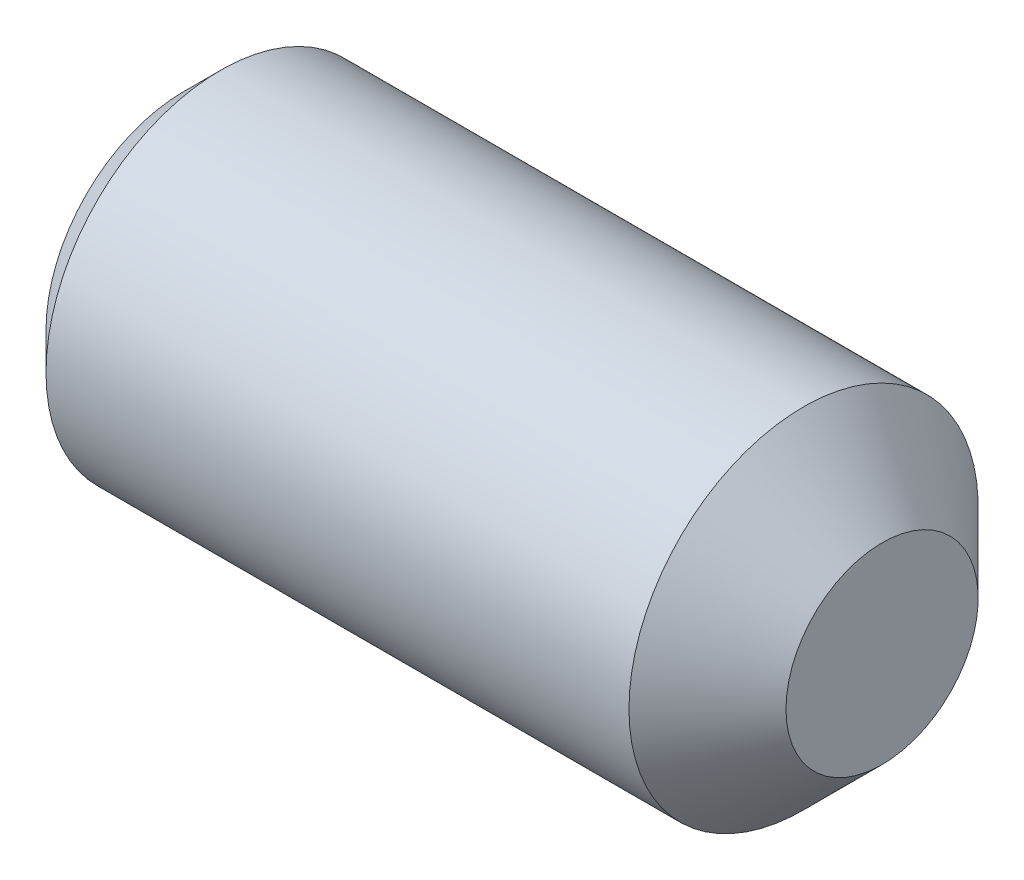
ISO-10303-21;
HEADER;
FILE_DESCRIPTION(('STEP AP214'),'2;1');
FILE_NAME('part.step','',(''),(''),'','','');
FILE_SCHEMA(('AUTOMOTIVE_DESIGN { 1 0 10303 214 1 1 1 1 }'));
ENDSEC;
DATA;
#1=APPLICATION_CONTEXT('core data for automotive mechanical design processes');
#2=APPLICATION_PROTOCOL_DEFINITION('international standard','automotive_design',2000,#1);
#3=PRODUCT_CONTEXT('',#1,'mechanical');
#4=PRODUCT('Part','Part','',(#3));
#5=PRODUCT_RELATED_PRODUCT_CATEGORY('part','',(#4));
#6=PRODUCT_DEFINITION_FORMATION('','',#4);
#7=PRODUCT_DEFINITION_CONTEXT('part definition',#1,'design');
#8=PRODUCT_DEFINITION('design','',#6,#7);
#9=PRODUCT_DEFINITION_SHAPE('','',#8);
#10=(LENGTH_UNIT() NAMED_UNIT(*) SI_UNIT(.MILLI.,.METRE.));
#11=(NAMED_UNIT(*) PLANE_ANGLE_UNIT() SI_UNIT($,.RADIAN.));
#12=(NAMED_UNIT(*) SI_UNIT($,.STERADIAN.) SOLID_ANGLE_UNIT());
#13=UNCERTAINTY_MEASURE_WITH_UNIT(LENGTH_MEASURE(1.E-05),#10,'distance_accuracy_value','');
#14=(GEOMETRIC_REPRESENTATION_CONTEXT(3) GLOBAL_UNCERTAINTY_ASSIGNED_CONTEXT((#13)) GLOBAL_UNIT_ASSIGNED_CONTEXT((#10,
#11,#12)) REPRESENTATION_CONTEXT('',''));
#15=CARTESIAN_POINT('',(0.,0.,0.));
#16=DIRECTION('',(0.,0.,1.));
#17=DIRECTION('',(1.,0.,0.));
#18=AXIS2_PLACEMENT_3D('',#15,#16,#17);
#19=CARTESIAN_POINT('',(0.,0.,0.));
#20=DIRECTION('',(-1.,0.,0.));
#21=DIRECTION('',(0.,0.,1.));
#22=AXIS2_PLACEMENT_3D('',#19,#20,#21);
#23=PLANE('',#22);
#24=CARTESIAN_POINT('',(0.,0.,0.));
#25=DIRECTION('',(-1.,0.,0.));
#26=DIRECTION('',(0.,0.,1.));
#27=AXIS2_PLACEMENT_3D('',#24,#25,#26);
#28=CIRCLE('',#27,3.12928);
#29=CARTESIAN_POINT('',(0.,0.,3.12928));
#30=VERTEX_POINT('',#29);
#31=EDGE_CURVE('E134',#30,#30,#28,.T.);
#32=ORIENTED_EDGE('',*,*,#31,.T.);
#33=EDGE_LOOP('',(#32));
#34=FACE_BOUND('',#33,.T.);
#35=DIRECTION('',(0.,0.,-1.));
#36=VECTOR('',#35,1.);
#37=CARTESIAN_POINT('',(0.,1.98374,1.14531282300223));
#38=LINE('',#37,#36);
#39=CARTESIAN_POINT('',(0.,1.98374,1.14531282300223));
#40=VERTEX_POINT('',#39);
#41=CARTESIAN_POINT('',(0.,1.98374,-1.14531282300222));
#42=VERTEX_POINT('',#41);
#43=EDGE_CURVE('E125',#40,#42,#38,.T.);
#44=ORIENTED_EDGE('',*,*,#43,.F.);
#45=DIRECTION('',(0.,-0.86602540378444,0.499999999999998));
#46=VECTOR('',#45,1.);
#47=CARTESIAN_POINT('',(0.,1.98374,1.14531282300223));
#48=LINE('',#47,#46);
#49=CARTESIAN_POINT('',(0.,0.,2.29062564600446));
#50=VERTEX_POINT('',#49);
#51=EDGE_CURVE('E47',#40,#50,#48,.T.);
#52=ORIENTED_EDGE('',*,*,#51,.T.);
#53=DIRECTION('',(0.,0.866025403784439,0.5));
#54=VECTOR('',#53,1.);
#55=CARTESIAN_POINT('',(0.,-1.98374,1.14531282300223));
#56=LINE('',#55,#54);
#57=CARTESIAN_POINT('',(0.,-1.98374,1.14531282300223));
#58=VERTEX_POINT('',#57);
#59=EDGE_CURVE('E116',#58,#50,#56,.T.);
#60=ORIENTED_EDGE('',*,*,#59,.F.);
#61=DIRECTION('',(0.,0.,-1.));
#62=VECTOR('',#61,1.);
#63=CARTESIAN_POINT('',(0.,-1.98374,1.14531282300223));
#64=LINE('',#63,#62);
#65=CARTESIAN_POINT('',(0.,-1.98374,-1.14531282300223));
#66=VERTEX_POINT('',#65);
#67=EDGE_CURVE('E119',#58,#66,#64,.T.);
#68=ORIENTED_EDGE('',*,*,#67,.T.);
#69=DIRECTION('',(0.,0.86602540378444,-0.499999999999998));
#70=VECTOR('',#69,1.);
#71=CARTESIAN_POINT('',(0.,-1.98374,-1.14531282300223));
#72=LINE('',#71,#70);
#73=CARTESIAN_POINT('',(0.,0.,-2.29062564600445));
#74=VERTEX_POINT('',#73);
#75=EDGE_CURVE('E122',#66,#74,#72,.T.);
#76=ORIENTED_EDGE('',*,*,#75,.T.);
#77=DIRECTION('',(0.,-0.866025403784439,-0.5));
#78=VECTOR('',#77,1.);
#79=CARTESIAN_POINT('',(0.,1.98374,-1.14531282300222));
#80=LINE('',#79,#78);
#81=EDGE_CURVE('E105',#42,#74,#80,.T.);
#82=ORIENTED_EDGE('',*,*,#81,.F.);
#83=EDGE_LOOP('',(#44,#52,#60,#68,#76,#82));
#84=FACE_BOUND('',#83,.T.);
#85=ADVANCED_FACE('F32',(#34,#84),#23,.T.);
#86=CARTESIAN_POINT('',(15.875,2.1844,0.));
#87=DIRECTION('',(1.,0.,0.));
#88=DIRECTION('',(0.,0.,-1.));
#89=AXIS2_PLACEMENT_3D('',#86,#87,#88);
#90=PLANE('',#89);
#91=CARTESIAN_POINT('',(15.875,0.,0.));
#92=DIRECTION('',(-1.,0.,0.));
#93=DIRECTION('',(0.,0.,1.));
#94=AXIS2_PLACEMENT_3D('',#91,#92,#93);
#95=CIRCLE('',#94,2.1844);
#96=CARTESIAN_POINT('',(15.875,0.,2.1844));
#97=VERTEX_POINT('',#96);
#98=EDGE_CURVE('E11',#97,#97,#95,.T.);
#99=ORIENTED_EDGE('',*,*,#98,.F.);
#100=EDGE_LOOP('',(#99));
#101=FACE_BOUND('',#100,.T.);
#102=ADVANCED_FACE('F34',(#101),#90,.T.);
#103=CARTESIAN_POINT('',(14.09065,0.,0.));
#104=DIRECTION('',(-1.,0.,0.));
#105=DIRECTION('',(0.,0.,1.));
#106=AXIS2_PLACEMENT_3D('',#103,#104,#105);
#107=CONICAL_SURFACE('',#106,3.96875,0.785398163397454);
#108=ORIENTED_EDGE('',*,*,#98,.T.);
#109=EDGE_LOOP('',(#108));
#110=FACE_BOUND('',#109,.T.);
#111=CARTESIAN_POINT('',(14.09065,0.,0.));
#112=DIRECTION('',(-1.,0.,0.));
#113=DIRECTION('',(0.,0.,1.));
#114=AXIS2_PLACEMENT_3D('',#111,#112,#113);
#115=CIRCLE('',#114,3.96875);
#116=CARTESIAN_POINT('',(14.09065,0.,3.96875));
#117=VERTEX_POINT('',#116);
#118=EDGE_CURVE('E40',#117,#117,#115,.T.);
#119=ORIENTED_EDGE('',*,*,#118,.F.);
#120=EDGE_LOOP('',(#119));
#121=FACE_BOUND('',#120,.T.);
#122=ADVANCED_FACE('F145',(#110,#121),#107,.T.);
#123=CARTESIAN_POINT('',(-12.7,0.,0.));
#124=DIRECTION('',(-1.,0.,0.));
#125=DIRECTION('',(0.,0.,1.));
#126=AXIS2_PLACEMENT_3D('',#123,#124,#125);
#127=CYLINDRICAL_SURFACE('',#126,3.96875);
#128=ORIENTED_EDGE('',*,*,#118,.T.);
#129=EDGE_LOOP('',(#128));
#130=FACE_BOUND('',#129,.T.);
#131=CARTESIAN_POINT('',(0.839470000000002,0.,0.));
#132=DIRECTION('',(-1.,0.,0.));
#133=DIRECTION('',(0.,0.,1.));
#134=AXIS2_PLACEMENT_3D('',#131,#132,#133);
#135=CIRCLE('',#134,3.96875);
#136=CARTESIAN_POINT('',(0.839470000000002,0.,3.96875));
#137=VERTEX_POINT('',#136);
#138=EDGE_CURVE('E137',#137,#137,#135,.T.);
#139=ORIENTED_EDGE('',*,*,#138,.F.);
#140=EDGE_LOOP('',(#139));
#141=FACE_BOUND('',#140,.T.);
#142=ADVANCED_FACE('F142',(#130,#141),#127,.T.);
#143=CARTESIAN_POINT('',(0.,0.,0.));
#144=DIRECTION('',(1.,0.,0.));
#145=DIRECTION('',(0.,0.,-1.));
#146=AXIS2_PLACEMENT_3D('',#143,#144,#145);
#147=CONICAL_SURFACE('',#146,3.12928,0.785398163397447);
#148=ORIENTED_EDGE('',*,*,#138,.T.);
#149=EDGE_LOOP('',(#148));
#150=FACE_BOUND('',#149,.T.);
#151=ORIENTED_EDGE('',*,*,#31,.F.);
#152=EDGE_LOOP('',(#151));
#153=FACE_BOUND('',#152,.T.);
#154=ADVANCED_FACE('F152',(#150,#153),#147,.T.);
#155=CARTESIAN_POINT('',(3.9624,1.98374,1.14531282300223));
#156=DIRECTION('',(0.,-0.499999999999998,-0.86602540378444));
#157=DIRECTION('',(0.,0.86602540378444,-0.499999999999998));
#158=AXIS2_PLACEMENT_3D('',#155,#156,#157);
#159=PLANE('',#158);
#160=ORIENTED_EDGE('',*,*,#51,.F.);
#161=DIRECTION('',(-1.,0.,0.));
#162=VECTOR('',#161,1.);
#163=CARTESIAN_POINT('',(3.9624,1.98374,1.14531282300223));
#164=LINE('',#163,#162);
#165=CARTESIAN_POINT('',(3.9624,1.98374,1.14531282300223));
#166=VERTEX_POINT('',#165);
#167=EDGE_CURVE('E52',#166,#40,#164,.T.);
#168=ORIENTED_EDGE('',*,*,#167,.F.);
#169=DIRECTION('',(0.,-0.86602540378444,0.499999999999998));
#170=VECTOR('',#169,1.);
#171=CARTESIAN_POINT('',(3.9624,1.98374,1.14531282300223));
#172=LINE('',#171,#170);
#173=CARTESIAN_POINT('',(3.9624,0.,2.29062564600446));
#174=VERTEX_POINT('',#173);
#175=EDGE_CURVE('E79',#166,#174,#172,.T.);
#176=ORIENTED_EDGE('',*,*,#175,.T.);
#177=DIRECTION('',(-1.,0.,0.));
#178=VECTOR('',#177,1.);
#179=CARTESIAN_POINT('',(3.9624,0.,2.29062564600446));
#180=LINE('',#179,#178);
#181=EDGE_CURVE('E132',#174,#50,#180,.T.);
#182=ORIENTED_EDGE('',*,*,#181,.T.);
#183=EDGE_LOOP('',(#160,#168,#176,#182));
#184=FACE_BOUND('',#183,.T.);
#185=ADVANCED_FACE('F163',(#184),#159,.T.);
#186=CARTESIAN_POINT('',(3.9624,-1.98374,1.14531282300223));
#187=DIRECTION('',(0.,-0.5,0.866025403784439));
#188=DIRECTION('',(0.,-0.866025403784439,-0.5));
#189=AXIS2_PLACEMENT_3D('',#186,#187,#188);
#190=PLANE('',#189);
#191=ORIENTED_EDGE('',*,*,#59,.T.);
#192=ORIENTED_EDGE('',*,*,#181,.F.);
#193=DIRECTION('',(0.,0.866025403784439,0.5));
#194=VECTOR('',#193,1.);
#195=CARTESIAN_POINT('',(3.9624,-1.98374,1.14531282300223));
#196=LINE('',#195,#194);
#197=CARTESIAN_POINT('',(3.9624,-1.98374,1.14531282300223));
#198=VERTEX_POINT('',#197);
#199=EDGE_CURVE('E261',#198,#174,#196,.T.);
#200=ORIENTED_EDGE('',*,*,#199,.F.);
#201=DIRECTION('',(-1.,0.,0.));
#202=VECTOR('',#201,1.);
#203=CARTESIAN_POINT('',(3.9624,-1.98374,1.14531282300223));
#204=LINE('',#203,#202);
#205=EDGE_CURVE('E130',#198,#58,#204,.T.);
#206=ORIENTED_EDGE('',*,*,#205,.T.);
#207=EDGE_LOOP('',(#191,#192,#200,#206));
#208=FACE_BOUND('',#207,.T.);
#209=ADVANCED_FACE('F170',(#208),#190,.F.);
#210=CARTESIAN_POINT('',(3.9624,-1.98374,1.14531282300223));
#211=DIRECTION('',(0.,1.,0.));
#212=DIRECTION('',(0.,0.,1.));
#213=AXIS2_PLACEMENT_3D('',#210,#211,#212);
#214=PLANE('',#213);
#215=ORIENTED_EDGE('',*,*,#67,.F.);
#216=ORIENTED_EDGE('',*,*,#205,.F.);
#217=DIRECTION('',(0.,0.,-1.));
#218=VECTOR('',#217,1.);
#219=CARTESIAN_POINT('',(3.9624,-1.98374,1.14531282300223));
#220=LINE('',#219,#218);
#221=CARTESIAN_POINT('',(3.9624,-1.98374,-1.14531282300223));
#222=VERTEX_POINT('',#221);
#223=EDGE_CURVE('E100',#198,#222,#220,.T.);
#224=ORIENTED_EDGE('',*,*,#223,.T.);
#225=DIRECTION('',(-1.,0.,0.));
#226=VECTOR('',#225,1.);
#227=CARTESIAN_POINT('',(3.9624,-1.98374,-1.14531282300223));
#228=LINE('',#227,#226);
#229=EDGE_CURVE('E95',#222,#66,#228,.T.);
#230=ORIENTED_EDGE('',*,*,#229,.T.);
#231=EDGE_LOOP('',(#215,#216,#224,#230));
#232=FACE_BOUND('',#231,.T.);
#233=ADVANCED_FACE('F177',(#232),#214,.T.);
#234=CARTESIAN_POINT('',(3.9624,-1.98374,-1.14531282300223));
#235=DIRECTION('',(0.,0.499999999999998,0.86602540378444));
#236=DIRECTION('',(0.,-0.86602540378444,0.499999999999998));
#237=AXIS2_PLACEMENT_3D('',#234,#235,#236);
#238=PLANE('',#237);
#239=ORIENTED_EDGE('',*,*,#75,.F.);
#240=ORIENTED_EDGE('',*,*,#229,.F.);
#241=DIRECTION('',(0.,0.86602540378444,-0.499999999999998));
#242=VECTOR('',#241,1.);
#243=CARTESIAN_POINT('',(3.9624,-1.98374,-1.14531282300223));
#244=LINE('',#243,#242);
#245=CARTESIAN_POINT('',(3.9624,0.,-2.29062564600445));
#246=VERTEX_POINT('',#245);
#247=EDGE_CURVE('E90',#222,#246,#244,.T.);
#248=ORIENTED_EDGE('',*,*,#247,.T.);
#249=DIRECTION('',(-1.,0.,0.));
#250=VECTOR('',#249,1.);
#251=CARTESIAN_POINT('',(3.9624,0.,-2.29062564600445));
#252=LINE('',#251,#250);
#253=EDGE_CURVE('E94',#246,#74,#252,.T.);
#254=ORIENTED_EDGE('',*,*,#253,.T.);
#255=EDGE_LOOP('',(#239,#240,#248,#254));
#256=FACE_BOUND('',#255,.T.);
#257=ADVANCED_FACE('F93',(#256),#238,.T.);
#258=CARTESIAN_POINT('',(3.9624,1.98374,-1.14531282300222));
#259=DIRECTION('',(0.,0.5,-0.866025403784439));
#260=DIRECTION('',(0.,0.866025403784439,0.5));
#261=AXIS2_PLACEMENT_3D('',#258,#259,#260);
#262=PLANE('',#261);
#263=ORIENTED_EDGE('',*,*,#81,.T.);
#264=ORIENTED_EDGE('',*,*,#253,.F.);
#265=DIRECTION('',(0.,-0.866025403784439,-0.5));
#266=VECTOR('',#265,1.);
#267=CARTESIAN_POINT('',(3.9624,1.98374,-1.14531282300222));
#268=LINE('',#267,#266);
#269=CARTESIAN_POINT('',(3.9624,1.98374,-1.14531282300222));
#270=VERTEX_POINT('',#269);
#271=EDGE_CURVE('E99',#270,#246,#268,.T.);
#272=ORIENTED_EDGE('',*,*,#271,.F.);
#273=DIRECTION('',(-1.,0.,0.));
#274=VECTOR('',#273,1.);
#275=CARTESIAN_POINT('',(3.9624,1.98374,-1.14531282300222));
#276=LINE('',#275,#274);
#277=EDGE_CURVE('E75',#270,#42,#276,.T.);
#278=ORIENTED_EDGE('',*,*,#277,.T.);
#279=EDGE_LOOP('',(#263,#264,#272,#278));
#280=FACE_BOUND('',#279,.T.);
#281=ADVANCED_FACE('F102',(#280),#262,.F.);
#282=CARTESIAN_POINT('',(3.9624,1.98374,1.14531282300223));
#283=DIRECTION('',(0.,1.,0.));
#284=DIRECTION('',(0.,0.,1.));
#285=AXIS2_PLACEMENT_3D('',#282,#283,#284);
#286=PLANE('',#285);
#287=ORIENTED_EDGE('',*,*,#43,.T.);
#288=ORIENTED_EDGE('',*,*,#277,.F.);
#289=DIRECTION('',(0.,0.,-1.));
#290=VECTOR('',#289,1.);
#291=CARTESIAN_POINT('',(3.9624,1.98374,1.14531282300223));
#292=LINE('',#291,#290);
#293=EDGE_CURVE('E110',#166,#270,#292,.T.);
#294=ORIENTED_EDGE('',*,*,#293,.F.);
#295=ORIENTED_EDGE('',*,*,#167,.T.);
#296=EDGE_LOOP('',(#287,#288,#294,#295));
#297=FACE_BOUND('',#296,.T.);
#298=ADVANCED_FACE('F189',(#297),#286,.F.);
#299=CARTESIAN_POINT('',(3.9624,1.98374,1.14531282300223));
#300=DIRECTION('',(1.,0.,0.));
#301=DIRECTION('',(0.,0.,-1.));
#302=AXIS2_PLACEMENT_3D('',#299,#300,#301);
#303=PLANE('',#302);
#304=ORIENTED_EDGE('',*,*,#175,.F.);
#305=ORIENTED_EDGE('',*,*,#293,.T.);
#306=ORIENTED_EDGE('',*,*,#271,.T.);
#307=ORIENTED_EDGE('',*,*,#247,.F.);
#308=ORIENTED_EDGE('',*,*,#223,.F.);
#309=ORIENTED_EDGE('',*,*,#199,.T.);
#310=EDGE_LOOP('',(#304,#305,#306,#307,#308,#309));
#311=FACE_BOUND('',#310,.T.);
#312=ADVANCED_FACE('F108',(#311),#303,.F.);
#313=CLOSED_SHELL('',(#85,#102,#122,#142,#154,#185,#209,#233,#257,#281,#298,#312));
#314=MANIFOLD_SOLID_BREP('B2',#313);
#315=ADVANCED_BREP_SHAPE_REPRESENTATION('',(#18,#314),#14);
#316=SHAPE_DEFINITION_REPRESENTATION(#9,#315);
ENDSEC;
END-ISO-10303-21;
